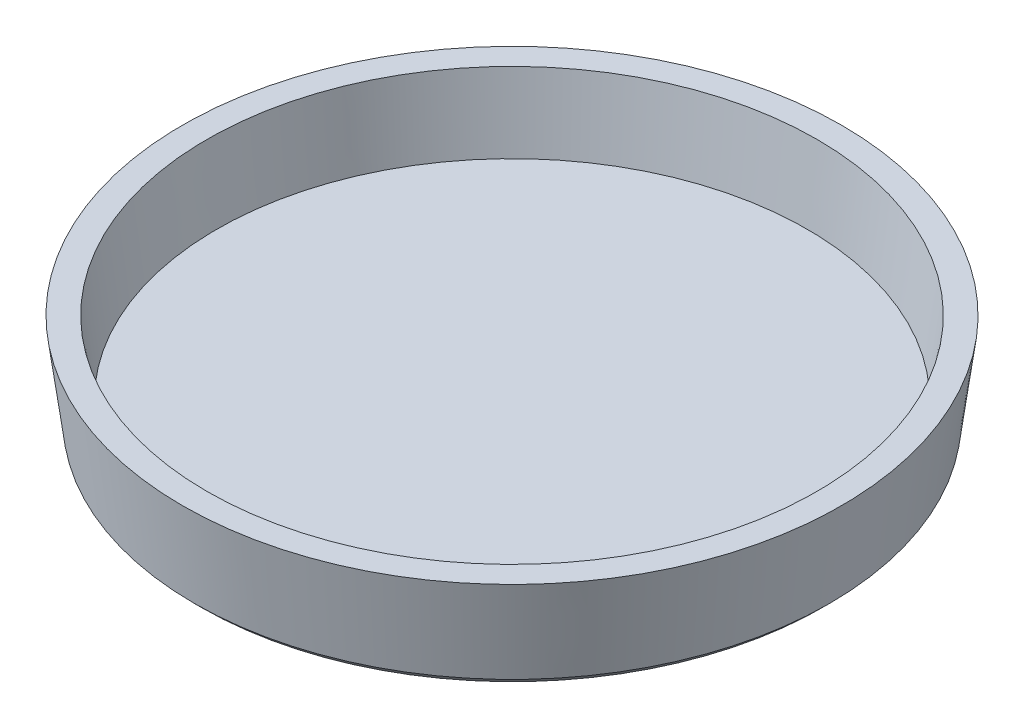
ISO-10303-21;
HEADER;
FILE_DESCRIPTION(('STEP AP214'),'2;1');
FILE_NAME('part.step','',(''),(''),'','','');
FILE_SCHEMA(('AUTOMOTIVE_DESIGN { 1 0 10303 214 1 1 1 1 }'));
ENDSEC;
DATA;
#1=APPLICATION_CONTEXT('core data for automotive mechanical design processes');
#2=APPLICATION_PROTOCOL_DEFINITION('international standard','automotive_design',2000,#1);
#3=PRODUCT_CONTEXT('',#1,'mechanical');
#4=PRODUCT('Part','Part','',(#3));
#5=PRODUCT_RELATED_PRODUCT_CATEGORY('part','',(#4));
#6=PRODUCT_DEFINITION_FORMATION('','',#4);
#7=PRODUCT_DEFINITION_CONTEXT('part definition',#1,'design');
#8=PRODUCT_DEFINITION('design','',#6,#7);
#9=PRODUCT_DEFINITION_SHAPE('','',#8);
#10=(LENGTH_UNIT() NAMED_UNIT(*) SI_UNIT(.MILLI.,.METRE.));
#11=(NAMED_UNIT(*) PLANE_ANGLE_UNIT() SI_UNIT($,.RADIAN.));
#12=(NAMED_UNIT(*) SI_UNIT($,.STERADIAN.) SOLID_ANGLE_UNIT());
#13=UNCERTAINTY_MEASURE_WITH_UNIT(LENGTH_MEASURE(1.E-05),#10,'distance_accuracy_value','');
#14=(GEOMETRIC_REPRESENTATION_CONTEXT(3) GLOBAL_UNCERTAINTY_ASSIGNED_CONTEXT((#13)) GLOBAL_UNIT_ASSIGNED_CONTEXT((#10,
#11,#12)) REPRESENTATION_CONTEXT('',''));
#15=CARTESIAN_POINT('',(0.,0.,0.));
#16=DIRECTION('',(0.,0.,1.));
#17=DIRECTION('',(1.,0.,0.));
#18=AXIS2_PLACEMENT_3D('',#15,#16,#17);
#19=CARTESIAN_POINT('',(0.,0.,0.));
#20=DIRECTION('',(0.,1.,0.));
#21=DIRECTION('',(0.,0.,1.));
#22=AXIS2_PLACEMENT_3D('',#19,#20,#21);
#23=PLANE('',#22);
#24=CARTESIAN_POINT('',(0.,0.,0.));
#25=DIRECTION('',(0.,1.,0.));
#26=DIRECTION('',(0.,0.,1.));
#27=AXIS2_PLACEMENT_3D('',#24,#25,#26);
#28=CIRCLE('',#27,40.513);
#29=CARTESIAN_POINT('',(0.,0.,40.513));
#30=VERTEX_POINT('',#29);
#31=EDGE_CURVE('E10',#30,#30,#28,.F.);
#32=ORIENTED_EDGE('',*,*,#31,.T.);
#33=EDGE_LOOP('',(#32));
#34=FACE_BOUND('',#33,.T.);
#35=ADVANCED_FACE('F38',(#34),#23,.F.);
#36=CARTESIAN_POINT('',(0.,0.,0.));
#37=DIRECTION('',(0.,1.,0.));
#38=DIRECTION('',(0.,0.,1.));
#39=AXIS2_PLACEMENT_3D('',#36,#37,#38);
#40=CONICAL_SURFACE('',#39,41.275,0.131248759749971);
#41=CARTESIAN_POINT('',(0.,0.877887901163166,0.));
#42=DIRECTION('',(0.,-1.,0.));
#43=DIRECTION('',(0.,0.,-1.));
#44=AXIS2_PLACEMENT_3D('',#41,#42,#43);
#45=CIRCLE('',#44,41.3908879011631);
#46=CARTESIAN_POINT('',(0.,0.877887901163161,41.3908879011632));
#47=VERTEX_POINT('',#46);
#48=EDGE_CURVE('E46',#47,#47,#45,.F.);
#49=ORIENTED_EDGE('',*,*,#48,.T.);
#50=EDGE_LOOP('',(#49));
#51=FACE_BOUND('',#50,.T.);
#52=CARTESIAN_POINT('',(0.,12.7,0.));
#53=DIRECTION('',(0.,1.,0.));
#54=DIRECTION('',(0.,0.,1.));
#55=AXIS2_PLACEMENT_3D('',#52,#53,#54);
#56=CIRCLE('',#55,42.9514968999137);
#57=CARTESIAN_POINT('',(0.,12.7,42.9514968999137));
#58=VERTEX_POINT('',#57);
#59=EDGE_CURVE('E50',#58,#58,#56,.T.);
#60=ORIENTED_EDGE('',*,*,#59,.F.);
#61=EDGE_LOOP('',(#60));
#62=FACE_BOUND('',#61,.T.);
#63=ADVANCED_FACE('F78',(#51,#62),#40,.T.);
#64=CARTESIAN_POINT('',(0.,12.7,-42.9514968999137));
#65=DIRECTION('',(0.,-1.,0.));
#66=DIRECTION('',(0.,0.,-1.));
#67=AXIS2_PLACEMENT_3D('',#64,#65,#66);
#68=PLANE('',#67);
#69=CARTESIAN_POINT('',(0.,12.7,0.));
#70=DIRECTION('',(0.,-1.,0.));
#71=DIRECTION('',(0.,0.,-1.));
#72=AXIS2_PLACEMENT_3D('',#69,#70,#71);
#73=CIRCLE('',#72,39.7489525807881);
#74=CARTESIAN_POINT('',(0.,12.7,-39.7489525807881));
#75=VERTEX_POINT('',#74);
#76=EDGE_CURVE('E57',#75,#75,#73,.F.);
#77=ORIENTED_EDGE('',*,*,#76,.F.);
#78=EDGE_LOOP('',(#77));
#79=FACE_BOUND('',#78,.T.);
#80=ORIENTED_EDGE('',*,*,#59,.T.);
#81=EDGE_LOOP('',(#80));
#82=FACE_BOUND('',#81,.T.);
#83=ADVANCED_FACE('F74',(#79,#82),#68,.F.);
#84=CARTESIAN_POINT('',(0.,3.175,0.));
#85=DIRECTION('',(0.,1.,0.));
#86=DIRECTION('',(0.,0.,1.));
#87=AXIS2_PLACEMENT_3D('',#84,#85,#86);
#88=PLANE('',#87);
#89=CARTESIAN_POINT('',(0.,3.175,0.));
#90=DIRECTION('',(0.,1.,0.));
#91=DIRECTION('',(0.,0.,1.));
#92=AXIS2_PLACEMENT_3D('',#89,#90,#91);
#93=CIRCLE('',#92,38.4915799058528);
#94=CARTESIAN_POINT('',(0.,3.17499999999999,38.4915799058528));
#95=VERTEX_POINT('',#94);
#96=EDGE_CURVE('E54',#95,#95,#93,.T.);
#97=ORIENTED_EDGE('',*,*,#96,.T.);
#98=EDGE_LOOP('',(#97));
#99=FACE_BOUND('',#98,.T.);
#100=ADVANCED_FACE('F63',(#99),#88,.T.);
#101=CARTESIAN_POINT('',(0.,0.415519437579503,0.));
#102=DIRECTION('',(0.,1.,0.));
#103=DIRECTION('',(0.,0.,1.));
#104=AXIS2_PLACEMENT_3D('',#101,#102,#103);
#105=CONICAL_SURFACE('',#104,38.1273074170126,0.131248759749971);
#106=ORIENTED_EDGE('',*,*,#76,.T.);
#107=EDGE_LOOP('',(#106));
#108=FACE_BOUND('',#107,.T.);
#109=ORIENTED_EDGE('',*,*,#96,.F.);
#110=EDGE_LOOP('',(#109));
#111=FACE_BOUND('',#110,.T.);
#112=ADVANCED_FACE('F65',(#108,#111),#105,.F.);
#113=CARTESIAN_POINT('',(0.,0.877887901163125,0.));
#114=DIRECTION('',(0.,1.,0.));
#115=DIRECTION('',(0.,0.,1.));
#116=AXIS2_PLACEMENT_3D('',#113,#114,#115);
#117=CONICAL_SURFACE('',#116,41.3908879011631,0.785398163397447);
#118=CARTESIAN_POINT('',(0.,0.,40.513));
#119=CARTESIAN_POINT('',(0.,0.00914466563711055,40.5221446656371));
#120=CARTESIAN_POINT('',(0.,0.0182893312742262,40.5312893312742));
#121=CARTESIAN_POINT('',(0.,0.0365786625484576,40.5495786625485));
#122=CARTESIAN_POINT('',(0.,0.0457233281855733,40.5587233281856));
#123=CARTESIAN_POINT('',(0.,0.0640126594598063,40.5770126594598));
#124=CARTESIAN_POINT('',(0.,0.0731573250969236,40.5861573250969));
#125=CARTESIAN_POINT('',(0.,0.0914466563711562,40.6044466563712));
#126=CARTESIAN_POINT('',(0.,0.100591322008271,40.6135913220083));
#127=CARTESIAN_POINT('',(0.,0.118880653282504,40.6318806532825));
#128=CARTESIAN_POINT('',(0.,0.128025318919622,40.6410253189196));
#129=CARTESIAN_POINT('',(0.,0.146314650193854,40.6593146501939));
#130=CARTESIAN_POINT('',(0.,0.15545931583097,40.668459315831));
#131=CARTESIAN_POINT('',(0.,0.173748647105202,40.6867486471052));
#132=CARTESIAN_POINT('',(0.,0.18289331274232,40.6958933127423));
#133=CARTESIAN_POINT('',(0.,0.201182644016552,40.7141826440166));
#134=CARTESIAN_POINT('',(0.,0.210327309653667,40.7233273096537));
#135=CARTESIAN_POINT('',(0.,0.2286166409279,40.7416166409279));
#136=CARTESIAN_POINT('',(0.,0.237761306565018,40.750761306565));
#137=CARTESIAN_POINT('',(0.,0.25605063783925,40.7690506378393));
#138=CARTESIAN_POINT('',(0.,0.265195303476366,40.7781953034764));
#139=CARTESIAN_POINT('',(0.,0.283484634750598,40.7964846347506));
#140=CARTESIAN_POINT('',(0.,0.292629300387716,40.8056293003877));
#141=CARTESIAN_POINT('',(0.,0.310918631661948,40.823918631662));
#142=CARTESIAN_POINT('',(0.,0.320063297299064,40.8330632972991));
#143=CARTESIAN_POINT('',(0.,0.338352628573296,40.8513526285733));
#144=CARTESIAN_POINT('',(0.,0.347497294210414,40.8604972942104));
#145=CARTESIAN_POINT('',(0.,0.365786625484646,40.8787866254847));
#146=CARTESIAN_POINT('',(0.,0.374931291121762,40.8879312911218));
#147=CARTESIAN_POINT('',(0.,0.393220622395994,40.906220622396));
#148=CARTESIAN_POINT('',(0.,0.402365288033112,40.9153652880331));
#149=CARTESIAN_POINT('',(0.,0.420654619307344,40.9336546193073));
#150=CARTESIAN_POINT('',(0.,0.42979928494446,40.9427992849445));
#151=CARTESIAN_POINT('',(0.,0.448088616218692,40.9610886162187));
#152=CARTESIAN_POINT('',(0.,0.45723328185581,40.9702332818558));
#153=CARTESIAN_POINT('',(0.,0.475522613130042,40.98852261313));
#154=CARTESIAN_POINT('',(0.,0.484667278767158,40.9976672787672));
#155=CARTESIAN_POINT('',(0.,0.50295661004139,41.0159566100414));
#156=CARTESIAN_POINT('',(0.,0.512101275678508,41.0251012756785));
#157=CARTESIAN_POINT('',(0.,0.530390606952741,41.0433906069527));
#158=CARTESIAN_POINT('',(0.,0.539535272589856,41.0525352725899));
#159=CARTESIAN_POINT('',(0.,0.557824603864088,41.0708246038641));
#160=CARTESIAN_POINT('',(0.,0.566969269501206,41.0799692695012));
#161=CARTESIAN_POINT('',(0.,0.585258600775439,41.0982586007754));
#162=CARTESIAN_POINT('',(0.,0.594403266412554,41.1074032664126));
#163=CARTESIAN_POINT('',(0.,0.612692597686786,41.1256925976868));
#164=CARTESIAN_POINT('',(0.,0.621837263323904,41.1348372633239));
#165=CARTESIAN_POINT('',(0.,0.640126594598137,41.1531265945981));
#166=CARTESIAN_POINT('',(0.,0.649271260235252,41.1622712602353));
#167=CARTESIAN_POINT('',(0.,0.667560591509484,41.1805605915095));
#168=CARTESIAN_POINT('',(0.,0.676705257146602,41.1897052571466));
#169=CARTESIAN_POINT('',(0.,0.694994588420835,41.2079945884208));
#170=CARTESIAN_POINT('',(0.,0.70413925405795,41.217139254058));
#171=CARTESIAN_POINT('',(0.,0.722428585332182,41.2354285853322));
#172=CARTESIAN_POINT('',(0.,0.7315732509693,41.2445732509693));
#173=CARTESIAN_POINT('',(0.,0.749862582243533,41.2628625822435));
#174=CARTESIAN_POINT('',(0.,0.759007247880648,41.2720072478807));
#175=CARTESIAN_POINT('',(0.,0.77729657915488,41.2902965791549));
#176=CARTESIAN_POINT('',(0.,0.786441244791998,41.299441244792));
#177=CARTESIAN_POINT('',(0.,0.804730576066231,41.3177305760662));
#178=CARTESIAN_POINT('',(0.,0.813875241703346,41.3268752417033));
#179=CARTESIAN_POINT('',(0.,0.832164572977578,41.3451645729776));
#180=CARTESIAN_POINT('',(0.,0.841309238614695,41.3543092386147));
#181=CARTESIAN_POINT('',(0.,0.859598569888929,41.3725985698889));
#182=CARTESIAN_POINT('',(0.,0.868743235526046,41.3817432355261));
#183=CARTESIAN_POINT('',(0.,0.877887901163161,41.3908879011632));
#184=B_SPLINE_CURVE_WITH_KNOTS('',3,(#118,#119,#120,#121,#122,#123,#124,#125,#126,#127,#128,
#129,#130,#131,#132,#133,#134,#135,#136,#137,#138,#139,#140,#141,#142,#143,#144,#145,#146,#147,
#148,#149,#150,#151,#152,#153,#154,#155,#156,#157,#158,#159,#160,#161,#162,#163,#164,#165,#166,
#167,#168,#169,#170,#171,#172,#173,#174,#175,#176,#177,#178,#179,#180,#181,#182,#183),
.UNSPECIFIED.,.F.,.F.,(4,2,2,2,2,2,2,2,2,2,2,2,2,2,2,2,2,2,2,2,2,2,2,2,2,2,2,2,2,2,2,2,4),(0.,
0.0387975305021289,0.0775950610042627,0.116392591506391,0.155190122008525,0.193987652510654,
0.232785183012788,0.271582713514917,0.31038024401705,0.349177774519179,0.387975305021313,
0.426772835523442,0.465570366025576,0.504367896527705,0.543165427029838,0.581962957531967,
0.620760488034101,0.65955801853623,0.698355549038364,0.737153079540493,0.775950610042626,
0.814748140544755,0.853545671046889,0.892343201549018,0.931140732051151,0.96993826255328,
1.00873579305541,1.04753332355754,1.08633085405968,1.12512838456181,1.16392591506394,
1.20272344556607,1.2415209760682),.UNSPECIFIED.);
#185=EDGE_CURVE('BSEAM41',#30,#47,#184,.T.);
#186=ORIENTED_EDGE('',*,*,#31,.F.);
#187=ORIENTED_EDGE('',*,*,#48,.F.);
#188=ORIENTED_EDGE('',*,*,#185,.T.);
#189=ORIENTED_EDGE('',*,*,#185,.F.);
#190=EDGE_LOOP('',(#186,#188,#187,#189));
#191=FACE_BOUND('',#190,.T.);
#192=ADVANCED_FACE('F41',(#191),#117,.T.);
#193=CLOSED_SHELL('',(#35,#63,#83,#100,#112,#192));
#194=MANIFOLD_SOLID_BREP('B2',#193);
#195=ADVANCED_BREP_SHAPE_REPRESENTATION('',(#18,#194),#14);
#196=SHAPE_DEFINITION_REPRESENTATION(#9,#195);
ENDSEC;
END-ISO-10303-21;
